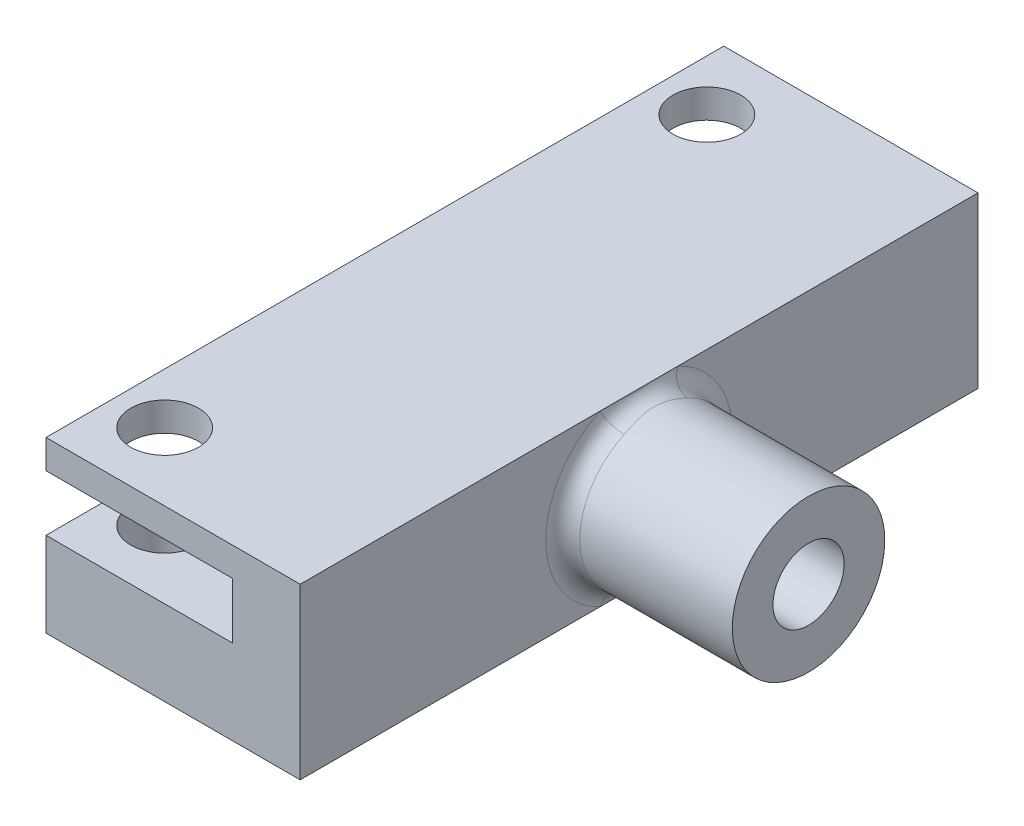
ISO-10303-21;
HEADER;
FILE_DESCRIPTION(('STEP AP214'),'2;1');
FILE_NAME('part.step','',(''),(''),'','','');
FILE_SCHEMA(('AUTOMOTIVE_DESIGN { 1 0 10303 214 1 1 1 1 }'));
ENDSEC;
DATA;
#1=APPLICATION_CONTEXT('core data for automotive mechanical design processes');
#2=APPLICATION_PROTOCOL_DEFINITION('international standard','automotive_design',2000,#1);
#3=PRODUCT_CONTEXT('',#1,'mechanical');
#4=PRODUCT('Part','Part','',(#3));
#5=PRODUCT_RELATED_PRODUCT_CATEGORY('part','',(#4));
#6=PRODUCT_DEFINITION_FORMATION('','',#4);
#7=PRODUCT_DEFINITION_CONTEXT('part definition',#1,'design');
#8=PRODUCT_DEFINITION('design','',#6,#7);
#9=PRODUCT_DEFINITION_SHAPE('','',#8);
#10=(LENGTH_UNIT() NAMED_UNIT(*) SI_UNIT(.MILLI.,.METRE.));
#11=(NAMED_UNIT(*) PLANE_ANGLE_UNIT() SI_UNIT($,.RADIAN.));
#12=(NAMED_UNIT(*) SI_UNIT($,.STERADIAN.) SOLID_ANGLE_UNIT());
#13=UNCERTAINTY_MEASURE_WITH_UNIT(LENGTH_MEASURE(1.E-05),#10,'distance_accuracy_value','');
#14=(GEOMETRIC_REPRESENTATION_CONTEXT(3) GLOBAL_UNCERTAINTY_ASSIGNED_CONTEXT((#13)) GLOBAL_UNIT_ASSIGNED_CONTEXT((#10,
#11,#12)) REPRESENTATION_CONTEXT('',''));
#15=CARTESIAN_POINT('',(0.,0.,0.));
#16=DIRECTION('',(0.,0.,1.));
#17=DIRECTION('',(1.,0.,0.));
#18=AXIS2_PLACEMENT_3D('',#15,#16,#17);
#19=CARTESIAN_POINT('',(4.,5.,40.));
#20=DIRECTION('',(-1.,0.,0.));
#21=DIRECTION('',(0.,-1.,0.));
#22=AXIS2_PLACEMENT_3D('',#19,#20,#21);
#23=PLANE('',#22);
#24=DIRECTION('',(0.,0.,-1.));
#25=VECTOR('',#24,1.);
#26=CARTESIAN_POINT('',(4.,5.,40.));
#27=LINE('',#26,#25);
#28=CARTESIAN_POINT('',(4.,5.,17.7087121525221));
#29=VERTEX_POINT('',#28);
#30=CARTESIAN_POINT('',(4.,5.,0.));
#31=VERTEX_POINT('',#30);
#32=EDGE_CURVE('E307',#29,#31,#27,.T.);
#33=ORIENTED_EDGE('',*,*,#32,.F.);
#34=CARTESIAN_POINT('',(4.,0.,20.));
#35=DIRECTION('',(-1.,0.,0.));
#36=DIRECTION('',(0.,-1.,0.));
#37=AXIS2_PLACEMENT_3D('',#34,#35,#36);
#38=CIRCLE('',#37,5.5);
#39=CARTESIAN_POINT('',(4.,-5.,17.7087121525221));
#40=VERTEX_POINT('',#39);
#41=EDGE_CURVE('E11',#29,#40,#38,.T.);
#42=ORIENTED_EDGE('',*,*,#41,.T.);
#43=DIRECTION('',(0.,0.,-1.));
#44=VECTOR('',#43,1.);
#45=CARTESIAN_POINT('',(4.,-5.,40.));
#46=LINE('',#45,#44);
#47=CARTESIAN_POINT('',(4.,-5.,0.));
#48=VERTEX_POINT('',#47);
#49=EDGE_CURVE('E281',#40,#48,#46,.T.);
#50=ORIENTED_EDGE('',*,*,#49,.T.);
#51=DIRECTION('',(0.,1.,0.));
#52=VECTOR('',#51,1.);
#53=CARTESIAN_POINT('',(4.,5.,0.));
#54=LINE('',#53,#52);
#55=EDGE_CURVE('E309',#48,#31,#54,.T.);
#56=ORIENTED_EDGE('',*,*,#55,.T.);
#57=EDGE_LOOP('',(#33,#42,#50,#56));
#58=FACE_BOUND('',#57,.T.);
#59=ADVANCED_FACE('F41',(#58),#23,.F.);
#60=CARTESIAN_POINT('',(0.,3.3,40.));
#61=DIRECTION('',(0.,1.,0.));
#62=DIRECTION('',(0.,0.,1.));
#63=AXIS2_PLACEMENT_3D('',#60,#61,#62);
#64=PLANE('',#63);
#65=CARTESIAN_POINT('',(-8.,3.3,36.));
#66=DIRECTION('',(0.,1.,0.));
#67=DIRECTION('',(0.,0.,1.));
#68=AXIS2_PLACEMENT_3D('',#65,#66,#67);
#69=CIRCLE('',#68,2.);
#70=CARTESIAN_POINT('',(-8.,3.3,38.));
#71=VERTEX_POINT('',#70);
#72=EDGE_CURVE('E298',#71,#71,#69,.T.);
#73=ORIENTED_EDGE('',*,*,#72,.T.);
#74=EDGE_LOOP('',(#73));
#75=FACE_BOUND('',#74,.T.);
#76=CARTESIAN_POINT('',(-8.,3.3,4.));
#77=DIRECTION('',(0.,1.,0.));
#78=DIRECTION('',(0.,0.,1.));
#79=AXIS2_PLACEMENT_3D('',#76,#77,#78);
#80=CIRCLE('',#79,2.);
#81=CARTESIAN_POINT('',(-8.,3.3,6.));
#82=VERTEX_POINT('',#81);
#83=EDGE_CURVE('E434',#82,#82,#80,.T.);
#84=ORIENTED_EDGE('',*,*,#83,.T.);
#85=EDGE_LOOP('',(#84));
#86=FACE_BOUND('',#85,.T.);
#87=DIRECTION('',(1.,0.,0.));
#88=VECTOR('',#87,1.);
#89=CARTESIAN_POINT('',(0.,3.3,0.));
#90=LINE('',#89,#88);
#91=CARTESIAN_POINT('',(-11.,3.3,0.));
#92=VERTEX_POINT('',#91);
#93=CARTESIAN_POINT('',(0.,3.3,0.));
#94=VERTEX_POINT('',#93);
#95=EDGE_CURVE('E163',#92,#94,#90,.T.);
#96=ORIENTED_EDGE('',*,*,#95,.T.);
#97=DIRECTION('',(0.,0.,-1.));
#98=VECTOR('',#97,1.);
#99=CARTESIAN_POINT('',(0.,3.3,40.));
#100=LINE('',#99,#98);
#101=CARTESIAN_POINT('',(0.,3.3,40.));
#102=VERTEX_POINT('',#101);
#103=EDGE_CURVE('E141',#102,#94,#100,.T.);
#104=ORIENTED_EDGE('',*,*,#103,.F.);
#105=DIRECTION('',(1.,0.,0.));
#106=VECTOR('',#105,1.);
#107=CARTESIAN_POINT('',(0.,3.3,40.));
#108=LINE('',#107,#106);
#109=CARTESIAN_POINT('',(-11.,3.3,40.));
#110=VERTEX_POINT('',#109);
#111=EDGE_CURVE('E149',#110,#102,#108,.T.);
#112=ORIENTED_EDGE('',*,*,#111,.F.);
#113=DIRECTION('',(0.,0.,-1.));
#114=VECTOR('',#113,1.);
#115=CARTESIAN_POINT('',(-11.,3.3,40.));
#116=LINE('',#115,#114);
#117=EDGE_CURVE('E356',#110,#92,#116,.T.);
#118=ORIENTED_EDGE('',*,*,#117,.T.);
#119=EDGE_LOOP('',(#96,#104,#112,#118));
#120=FACE_BOUND('',#119,.T.);
#121=ADVANCED_FACE('F161',(#75,#86,#120),#64,.F.);
#122=CARTESIAN_POINT('',(0.,0.,40.));
#123=DIRECTION('',(1.,0.,0.));
#124=DIRECTION('',(0.,0.,-1.));
#125=AXIS2_PLACEMENT_3D('',#122,#123,#124);
#126=PLANE('',#125);
#127=DIRECTION('',(0.,-1.,0.));
#128=VECTOR('',#127,1.);
#129=CARTESIAN_POINT('',(0.,0.,0.));
#130=LINE('',#129,#128);
#131=CARTESIAN_POINT('',(0.,0.,0.));
#132=VERTEX_POINT('',#131);
#133=EDGE_CURVE('E346',#94,#132,#130,.T.);
#134=ORIENTED_EDGE('',*,*,#133,.T.);
#135=DIRECTION('',(0.,0.,-1.));
#136=VECTOR('',#135,1.);
#137=CARTESIAN_POINT('',(0.,0.,40.));
#138=LINE('',#137,#136);
#139=CARTESIAN_POINT('',(0.,0.,40.));
#140=VERTEX_POINT('',#139);
#141=EDGE_CURVE('E144',#140,#132,#138,.T.);
#142=ORIENTED_EDGE('',*,*,#141,.F.);
#143=DIRECTION('',(0.,-1.,0.));
#144=VECTOR('',#143,1.);
#145=CARTESIAN_POINT('',(0.,0.,40.));
#146=LINE('',#145,#144);
#147=EDGE_CURVE('E137',#102,#140,#146,.T.);
#148=ORIENTED_EDGE('',*,*,#147,.F.);
#149=ORIENTED_EDGE('',*,*,#103,.T.);
#150=EDGE_LOOP('',(#134,#142,#148,#149));
#151=FACE_BOUND('',#150,.T.);
#152=ADVANCED_FACE('F139',(#151),#126,.F.);
#153=CARTESIAN_POINT('',(-11.,0.,40.));
#154=DIRECTION('',(0.,-1.,0.));
#155=DIRECTION('',(0.,0.,-1.));
#156=AXIS2_PLACEMENT_3D('',#153,#154,#155);
#157=PLANE('',#156);
#158=CARTESIAN_POINT('',(-8.,0.,36.));
#159=DIRECTION('',(0.,-1.,0.));
#160=DIRECTION('',(0.,0.,-1.));
#161=AXIS2_PLACEMENT_3D('',#158,#159,#160);
#162=CIRCLE('',#161,2.);
#163=CARTESIAN_POINT('',(-8.,0.,34.));
#164=VERTEX_POINT('',#163);
#165=EDGE_CURVE('E431',#164,#164,#162,.T.);
#166=ORIENTED_EDGE('',*,*,#165,.T.);
#167=EDGE_LOOP('',(#166));
#168=FACE_BOUND('',#167,.T.);
#169=CARTESIAN_POINT('',(-8.,0.,4.));
#170=DIRECTION('',(0.,-1.,0.));
#171=DIRECTION('',(0.,0.,-1.));
#172=AXIS2_PLACEMENT_3D('',#169,#170,#171);
#173=CIRCLE('',#172,2.);
#174=CARTESIAN_POINT('',(-8.,0.,2.));
#175=VERTEX_POINT('',#174);
#176=EDGE_CURVE('E441',#175,#175,#173,.T.);
#177=ORIENTED_EDGE('',*,*,#176,.T.);
#178=EDGE_LOOP('',(#177));
#179=FACE_BOUND('',#178,.T.);
#180=DIRECTION('',(-1.,0.,0.));
#181=VECTOR('',#180,1.);
#182=CARTESIAN_POINT('',(-11.,0.,0.));
#183=LINE('',#182,#181);
#184=CARTESIAN_POINT('',(-11.,0.,0.));
#185=VERTEX_POINT('',#184);
#186=EDGE_CURVE('E338',#132,#185,#183,.T.);
#187=ORIENTED_EDGE('',*,*,#186,.T.);
#188=DIRECTION('',(0.,0.,-1.));
#189=VECTOR('',#188,1.);
#190=CARTESIAN_POINT('',(-11.,0.,40.));
#191=LINE('',#190,#189);
#192=CARTESIAN_POINT('',(-11.,0.,40.));
#193=VERTEX_POINT('',#192);
#194=EDGE_CURVE('E171',#193,#185,#191,.T.);
#195=ORIENTED_EDGE('',*,*,#194,.F.);
#196=DIRECTION('',(-1.,0.,0.));
#197=VECTOR('',#196,1.);
#198=CARTESIAN_POINT('',(-11.,0.,40.));
#199=LINE('',#198,#197);
#200=EDGE_CURVE('E148',#140,#193,#199,.T.);
#201=ORIENTED_EDGE('',*,*,#200,.F.);
#202=ORIENTED_EDGE('',*,*,#141,.T.);
#203=EDGE_LOOP('',(#187,#195,#201,#202));
#204=FACE_BOUND('',#203,.T.);
#205=ADVANCED_FACE('F370',(#168,#179,#204),#157,.F.);
#206=CARTESIAN_POINT('',(-11.,-5.,40.));
#207=DIRECTION('',(1.,0.,0.));
#208=DIRECTION('',(0.,0.,-1.));
#209=AXIS2_PLACEMENT_3D('',#206,#207,#208);
#210=PLANE('',#209);
#211=DIRECTION('',(0.,-1.,0.));
#212=VECTOR('',#211,1.);
#213=CARTESIAN_POINT('',(-11.,-5.,0.));
#214=LINE('',#213,#212);
#215=CARTESIAN_POINT('',(-11.,-5.,0.));
#216=VERTEX_POINT('',#215);
#217=EDGE_CURVE('E331',#185,#216,#214,.T.);
#218=ORIENTED_EDGE('',*,*,#217,.T.);
#219=DIRECTION('',(0.,0.,-1.));
#220=VECTOR('',#219,1.);
#221=CARTESIAN_POINT('',(-11.,-5.,40.));
#222=LINE('',#221,#220);
#223=CARTESIAN_POINT('',(-11.,-5.,40.));
#224=VERTEX_POINT('',#223);
#225=EDGE_CURVE('E279',#224,#216,#222,.T.);
#226=ORIENTED_EDGE('',*,*,#225,.F.);
#227=DIRECTION('',(0.,-1.,0.));
#228=VECTOR('',#227,1.);
#229=CARTESIAN_POINT('',(-11.,-5.,40.));
#230=LINE('',#229,#228);
#231=EDGE_CURVE('E332',#193,#224,#230,.T.);
#232=ORIENTED_EDGE('',*,*,#231,.F.);
#233=ORIENTED_EDGE('',*,*,#194,.T.);
#234=EDGE_LOOP('',(#218,#226,#232,#233));
#235=FACE_BOUND('',#234,.T.);
#236=ADVANCED_FACE('F268',(#235),#210,.F.);
#237=CARTESIAN_POINT('',(4.,-5.,40.));
#238=DIRECTION('',(0.,1.,0.));
#239=DIRECTION('',(-1.,0.,0.));
#240=AXIS2_PLACEMENT_3D('',#237,#238,#239);
#241=PLANE('',#240);
#242=CARTESIAN_POINT('',(-8.,-5.,36.));
#243=DIRECTION('',(0.,1.,0.));
#244=DIRECTION('',(0.,0.,1.));
#245=AXIS2_PLACEMENT_3D('',#242,#243,#244);
#246=CIRCLE('',#245,2.);
#247=CARTESIAN_POINT('',(-8.,-5.,38.));
#248=VERTEX_POINT('',#247);
#249=EDGE_CURVE('E428',#248,#248,#246,.T.);
#250=ORIENTED_EDGE('',*,*,#249,.T.);
#251=EDGE_LOOP('',(#250));
#252=FACE_BOUND('',#251,.T.);
#253=CARTESIAN_POINT('',(-8.,-5.,4.));
#254=DIRECTION('',(0.,1.,0.));
#255=DIRECTION('',(0.,0.,1.));
#256=AXIS2_PLACEMENT_3D('',#253,#254,#255);
#257=CIRCLE('',#256,2.);
#258=CARTESIAN_POINT('',(-8.,-5.,6.));
#259=VERTEX_POINT('',#258);
#260=EDGE_CURVE('E465',#259,#259,#257,.T.);
#261=ORIENTED_EDGE('',*,*,#260,.T.);
#262=EDGE_LOOP('',(#261));
#263=FACE_BOUND('',#262,.T.);
#264=DIRECTION('',(1.,0.,0.));
#265=VECTOR('',#264,1.);
#266=CARTESIAN_POINT('',(4.,-5.,0.));
#267=LINE('',#266,#265);
#268=EDGE_CURVE('E340',#216,#48,#267,.T.);
#269=ORIENTED_EDGE('',*,*,#268,.T.);
#270=ORIENTED_EDGE('',*,*,#49,.F.);
#271=CARTESIAN_POINT('',(4.,-5.,22.2912878474779));
#272=VERTEX_POINT('',#271);
#273=EDGE_CURVE('E68',#272,#40,#46,.T.);
#274=ORIENTED_EDGE('',*,*,#273,.F.);
#275=CARTESIAN_POINT('',(4.,-5.,40.));
#276=VERTEX_POINT('',#275);
#277=EDGE_CURVE('E271',#276,#272,#46,.T.);
#278=ORIENTED_EDGE('',*,*,#277,.F.);
#279=DIRECTION('',(1.,0.,0.));
#280=VECTOR('',#279,1.);
#281=CARTESIAN_POINT('',(4.,-5.,40.));
#282=LINE('',#281,#280);
#283=EDGE_CURVE('E374',#224,#276,#282,.T.);
#284=ORIENTED_EDGE('',*,*,#283,.F.);
#285=ORIENTED_EDGE('',*,*,#225,.T.);
#286=EDGE_LOOP('',(#269,#270,#274,#278,#284,#285));
#287=FACE_BOUND('',#286,.T.);
#288=ADVANCED_FACE('F212',(#252,#263,#287),#241,.F.);
#289=ORIENTED_EDGE('',*,*,#277,.T.);
#290=CARTESIAN_POINT('',(4.,0.,20.));
#291=DIRECTION('',(-1.,0.,0.));
#292=DIRECTION('',(0.,-1.,0.));
#293=AXIS2_PLACEMENT_3D('',#290,#291,#292);
#294=CIRCLE('',#293,5.5);
#295=CARTESIAN_POINT('',(4.,5.,22.2912878474779));
#296=VERTEX_POINT('',#295);
#297=EDGE_CURVE('E55',#272,#296,#294,.T.);
#298=ORIENTED_EDGE('',*,*,#297,.T.);
#299=CARTESIAN_POINT('',(4.,5.,40.));
#300=VERTEX_POINT('',#299);
#301=EDGE_CURVE('E315',#300,#296,#27,.T.);
#302=ORIENTED_EDGE('',*,*,#301,.F.);
#303=DIRECTION('',(0.,1.,0.));
#304=VECTOR('',#303,1.);
#305=CARTESIAN_POINT('',(4.,5.,40.));
#306=LINE('',#305,#304);
#307=EDGE_CURVE('E276',#276,#300,#306,.T.);
#308=ORIENTED_EDGE('',*,*,#307,.F.);
#309=EDGE_LOOP('',(#289,#298,#302,#308));
#310=FACE_BOUND('',#309,.T.);
#311=ADVANCED_FACE('F209',(#310),#23,.F.);
#312=CARTESIAN_POINT('',(-11.,5.,40.));
#313=DIRECTION('',(0.,-1.,0.));
#314=DIRECTION('',(0.,0.,-1.));
#315=AXIS2_PLACEMENT_3D('',#312,#313,#314);
#316=PLANE('',#315);
#317=CARTESIAN_POINT('',(-8.,5.,36.));
#318=DIRECTION('',(0.,1.,0.));
#319=DIRECTION('',(0.,0.,1.));
#320=AXIS2_PLACEMENT_3D('',#317,#318,#319);
#321=CIRCLE('',#320,2.);
#322=CARTESIAN_POINT('',(-8.,5.,38.));
#323=VERTEX_POINT('',#322);
#324=EDGE_CURVE('E469',#323,#323,#321,.T.);
#325=ORIENTED_EDGE('',*,*,#324,.F.);
#326=EDGE_LOOP('',(#325));
#327=FACE_BOUND('',#326,.T.);
#328=CARTESIAN_POINT('',(-8.,5.,4.));
#329=DIRECTION('',(0.,1.,0.));
#330=DIRECTION('',(0.,0.,1.));
#331=AXIS2_PLACEMENT_3D('',#328,#329,#330);
#332=CIRCLE('',#331,2.);
#333=CARTESIAN_POINT('',(-8.,5.,6.));
#334=VERTEX_POINT('',#333);
#335=EDGE_CURVE('E461',#334,#334,#332,.T.);
#336=ORIENTED_EDGE('',*,*,#335,.F.);
#337=EDGE_LOOP('',(#336));
#338=FACE_BOUND('',#337,.T.);
#339=DIRECTION('',(-1.,0.,0.));
#340=VECTOR('',#339,1.);
#341=CARTESIAN_POINT('',(-11.,5.,0.));
#342=LINE('',#341,#340);
#343=CARTESIAN_POINT('',(-11.,5.,0.));
#344=VERTEX_POINT('',#343);
#345=EDGE_CURVE('E352',#31,#344,#342,.T.);
#346=ORIENTED_EDGE('',*,*,#345,.T.);
#347=DIRECTION('',(0.,0.,-1.));
#348=VECTOR('',#347,1.);
#349=CARTESIAN_POINT('',(-11.,5.,40.));
#350=LINE('',#349,#348);
#351=CARTESIAN_POINT('',(-11.,5.,40.));
#352=VERTEX_POINT('',#351);
#353=EDGE_CURVE('E313',#352,#344,#350,.T.);
#354=ORIENTED_EDGE('',*,*,#353,.F.);
#355=DIRECTION('',(-1.,0.,0.));
#356=VECTOR('',#355,1.);
#357=CARTESIAN_POINT('',(-11.,5.,40.));
#358=LINE('',#357,#356);
#359=EDGE_CURVE('E361',#300,#352,#358,.T.);
#360=ORIENTED_EDGE('',*,*,#359,.F.);
#361=ORIENTED_EDGE('',*,*,#301,.T.);
#362=EDGE_CURVE('E304',#296,#29,#27,.T.);
#363=ORIENTED_EDGE('',*,*,#362,.T.);
#364=ORIENTED_EDGE('',*,*,#32,.T.);
#365=EDGE_LOOP('',(#346,#354,#360,#361,#363,#364));
#366=FACE_BOUND('',#365,.T.);
#367=ADVANCED_FACE('F260',(#327,#338,#366),#316,.F.);
#368=CARTESIAN_POINT('',(-11.,3.3,40.));
#369=DIRECTION('',(1.,0.,0.));
#370=DIRECTION('',(0.,0.,-1.));
#371=AXIS2_PLACEMENT_3D('',#368,#369,#370);
#372=PLANE('',#371);
#373=DIRECTION('',(0.,-1.,0.));
#374=VECTOR('',#373,1.);
#375=CARTESIAN_POINT('',(-11.,3.3,0.));
#376=LINE('',#375,#374);
#377=EDGE_CURVE('E159',#344,#92,#376,.T.);
#378=ORIENTED_EDGE('',*,*,#377,.T.);
#379=ORIENTED_EDGE('',*,*,#117,.F.);
#380=DIRECTION('',(0.,-1.,0.));
#381=VECTOR('',#380,1.);
#382=CARTESIAN_POINT('',(-11.,3.3,40.));
#383=LINE('',#382,#381);
#384=EDGE_CURVE('E154',#352,#110,#383,.T.);
#385=ORIENTED_EDGE('',*,*,#384,.F.);
#386=ORIENTED_EDGE('',*,*,#353,.T.);
#387=EDGE_LOOP('',(#378,#379,#385,#386));
#388=FACE_BOUND('',#387,.T.);
#389=ADVANCED_FACE('F266',(#388),#372,.F.);
#390=CARTESIAN_POINT('',(0.,0.,40.));
#391=DIRECTION('',(0.,0.,-1.));
#392=DIRECTION('',(-1.,0.,0.));
#393=AXIS2_PLACEMENT_3D('',#390,#391,#392);
#394=PLANE('',#393);
#395=ORIENTED_EDGE('',*,*,#111,.T.);
#396=ORIENTED_EDGE('',*,*,#147,.T.);
#397=ORIENTED_EDGE('',*,*,#200,.T.);
#398=ORIENTED_EDGE('',*,*,#231,.T.);
#399=ORIENTED_EDGE('',*,*,#283,.T.);
#400=ORIENTED_EDGE('',*,*,#307,.T.);
#401=ORIENTED_EDGE('',*,*,#359,.T.);
#402=ORIENTED_EDGE('',*,*,#384,.T.);
#403=EDGE_LOOP('',(#395,#396,#397,#398,#399,#400,#401,#402));
#404=FACE_BOUND('',#403,.T.);
#405=ADVANCED_FACE('F152',(#404),#394,.F.);
#406=CARTESIAN_POINT('',(0.,0.,0.));
#407=DIRECTION('',(0.,0.,-1.));
#408=DIRECTION('',(-1.,0.,0.));
#409=AXIS2_PLACEMENT_3D('',#406,#407,#408);
#410=PLANE('',#409);
#411=ORIENTED_EDGE('',*,*,#95,.F.);
#412=ORIENTED_EDGE('',*,*,#377,.F.);
#413=ORIENTED_EDGE('',*,*,#345,.F.);
#414=ORIENTED_EDGE('',*,*,#55,.F.);
#415=ORIENTED_EDGE('',*,*,#268,.F.);
#416=ORIENTED_EDGE('',*,*,#217,.F.);
#417=ORIENTED_EDGE('',*,*,#186,.F.);
#418=ORIENTED_EDGE('',*,*,#133,.F.);
#419=EDGE_LOOP('',(#411,#412,#413,#414,#415,#416,#417,#418));
#420=FACE_BOUND('',#419,.T.);
#421=ADVANCED_FACE('F337',(#420),#410,.T.);
#422=CARTESIAN_POINT('',(14.,0.,20.));
#423=DIRECTION('',(1.,0.,0.));
#424=DIRECTION('',(0.,1.,0.));
#425=AXIS2_PLACEMENT_3D('',#422,#423,#424);
#426=PLANE('',#425);
#427=CARTESIAN_POINT('',(14.,0.,20.));
#428=DIRECTION('',(1.,0.,0.));
#429=DIRECTION('',(0.,1.,0.));
#430=AXIS2_PLACEMENT_3D('',#427,#428,#429);
#431=CIRCLE('',#430,4.5);
#432=CARTESIAN_POINT('',(14.,4.5,20.));
#433=VERTEX_POINT('',#432);
#434=EDGE_CURVE('E368',#433,#433,#431,.T.);
#435=ORIENTED_EDGE('',*,*,#434,.T.);
#436=EDGE_LOOP('',(#435));
#437=FACE_BOUND('',#436,.T.);
#438=CARTESIAN_POINT('',(14.,0.,20.));
#439=DIRECTION('',(1.,0.,0.));
#440=DIRECTION('',(0.,1.,0.));
#441=AXIS2_PLACEMENT_3D('',#438,#439,#440);
#442=CIRCLE('',#441,2.1);
#443=CARTESIAN_POINT('',(14.,2.1,20.));
#444=VERTEX_POINT('',#443);
#445=EDGE_CURVE('E445',#444,#444,#442,.T.);
#446=ORIENTED_EDGE('',*,*,#445,.F.);
#447=EDGE_LOOP('',(#446));
#448=FACE_BOUND('',#447,.T.);
#449=ADVANCED_FACE('F392',(#437,#448),#426,.T.);
#450=CARTESIAN_POINT('',(14.,0.,20.));
#451=DIRECTION('',(-1.,0.,0.));
#452=DIRECTION('',(0.,-1.,0.));
#453=AXIS2_PLACEMENT_3D('',#450,#451,#452);
#454=CYLINDRICAL_SURFACE('',#453,4.5);
#455=CARTESIAN_POINT('',(5.,0.,20.));
#456=DIRECTION('',(-1.,0.,0.));
#457=DIRECTION('',(0.,-1.,0.));
#458=AXIS2_PLACEMENT_3D('',#455,#456,#457);
#459=CIRCLE('',#458,4.5);
#460=CARTESIAN_POINT('',(5.,-4.09090909090909,18.1253099429726));
#461=VERTEX_POINT('',#460);
#462=CARTESIAN_POINT('',(5.,4.09090909090909,18.1253099429726));
#463=VERTEX_POINT('',#462);
#464=EDGE_CURVE('E165',#461,#463,#459,.F.);
#465=ORIENTED_EDGE('',*,*,#464,.T.);
#466=CARTESIAN_POINT('',(4.89980268618255,3.73393876780257,17.4884862575926));
#467=CARTESIAN_POINT('',(3.48940132317829,3.94696045096598,17.8051916403727));
#468=CARTESIAN_POINT('',(4.,5.,16.9303720926132));
#469=CARTESIAN_POINT('',(4.91875517679815,3.7660163024793,17.5361518202028));
#470=CARTESIAN_POINT('',(3.54267675943292,3.9421366135648,17.806457821017));
#471=CARTESIAN_POINT('',(4.,5.,16.9886300023851));
#472=CARTESIAN_POINT('',(4.93432888211617,3.79752415859403,17.5849906414992));
#473=CARTESIAN_POINT('',(3.59466185138125,3.94380984297682,17.8158823635887));
#474=CARTESIAN_POINT('',(4.,5.,17.048321895073));
#475=CARTESIAN_POINT('',(4.95980674885914,3.85896643460317,17.6844542129241));
#476=CARTESIAN_POINT('',(3.69168052997434,3.95645627119008,17.8478816349394));
#477=CARTESIAN_POINT('',(4.,5.,17.1698884824051));
#478=CARTESIAN_POINT('',(4.96972465819049,3.88890450785788,17.7350743121084));
#479=CARTESIAN_POINT('',(3.73710484762568,3.96705590696896,17.8699429285316));
#480=CARTESIAN_POINT('',(4.,5.,17.2317574925616));
#481=CARTESIAN_POINT('',(4.98498959684164,3.94666476101884,17.8373016855898));
#482=CARTESIAN_POINT('',(3.81998814107779,3.99358718250039,17.9236546713916));
#483=CARTESIAN_POINT('',(4.,5.,17.3567020601805));
#484=CARTESIAN_POINT('',(4.99037807381264,3.97450395692022,17.8888954904891));
#485=CARTESIAN_POINT('',(3.85786389780673,4.00931053118533,17.9549356972279));
#486=CARTESIAN_POINT('',(4.,5.,17.419761155046));
#487=CARTESIAN_POINT('',(4.99760774902755,4.02822327119306,17.9932947866256));
#488=CARTESIAN_POINT('',(3.92672527792871,4.043635816781,18.0248026450247));
#489=CARTESIAN_POINT('',(4.,5.,17.54736029476));
#490=CARTESIAN_POINT('',(4.99944616154779,4.05410183577859,18.0461011965401));
#491=CARTESIAN_POINT('',(3.95800324290997,4.06219454556076,18.0632573539657));
#492=CARTESIAN_POINT('',(4.,5.,17.6119014624364));
#493=CARTESIAN_POINT('',(5.00073660820922,4.12583442170718,18.2000522957203));
#494=CARTESIAN_POINT('',(4.03837463547946,4.11676073922267,18.180963318938));
#495=CARTESIAN_POINT('',(4.,5.,17.8000639169943));
#496=CARTESIAN_POINT('',(4.99661844902085,4.16901373085712,18.3024697766345));
#497=CARTESIAN_POINT('',(4.08165834204945,4.1549755688104,18.2686045059631));
#498=CARTESIAN_POINT('',(4.,5.,17.9252408381086));
#499=CARTESIAN_POINT('',(4.98268477148127,4.24760803014444,18.5099797285338));
#500=CARTESIAN_POINT('',(4.1511064969848,4.22841215489659,18.4562196688614));
#501=CARTESIAN_POINT('',(4.,5.,18.1788641126508));
#502=CARTESIAN_POINT('',(4.97286595162368,4.28301850461551,18.615073715852));
#503=CARTESIAN_POINT('',(4.17821291351062,4.26404589394782,18.5564738266611));
#504=CARTESIAN_POINT('',(4.,5.,18.3073123193745));
#505=CARTESIAN_POINT('',(4.95095988247223,4.34610963053365,18.8279460580946));
#506=CARTESIAN_POINT('',(4.22064381620443,4.32911457682245,18.7653299811448));
#507=CARTESIAN_POINT('',(4.,5.,18.5674896265602));
#508=CARTESIAN_POINT('',(4.93886200880405,4.37375250347942,18.9357348474117));
#509=CARTESIAN_POINT('',(4.23643651412229,4.35896572776856,18.8745497085902));
#510=CARTESIAN_POINT('',(4.,5.,18.6992314801688));
#511=CARTESIAN_POINT('',(4.91553832410221,4.42099221999677,19.1531227589253));
#512=CARTESIAN_POINT('',(4.26018466902875,4.41048128492815,19.0980421546623));
#513=CARTESIAN_POINT('',(4.,5.,18.9649278164628));
#514=CARTESIAN_POINT('',(4.90431250029528,4.44058918143815,19.2627218545768));
#515=CARTESIAN_POINT('',(4.26839824762161,4.43251464082034,19.2130364624769));
#516=CARTESIAN_POINT('',(4.,5.,19.0988822667046));
#517=CARTESIAN_POINT('',(4.88465296854667,4.47285316773795,19.492038302015));
#518=CARTESIAN_POINT('',(4.28055590189765,4.46879730869868,19.4550216591649));
#519=CARTESIAN_POINT('',(4.,5.,19.3791579246855));
#520=CARTESIAN_POINT('',(4.87651097080095,4.48484806770604,19.6118692918401));
#521=CARTESIAN_POINT('',(4.28424818338475,4.48262092813386,19.5833728362504));
#522=CARTESIAN_POINT('',(4.,5.,19.5256180233603));
#523=CARTESIAN_POINT('',(4.86666051596601,4.49918608673101,19.8522852890041));
#524=CARTESIAN_POINT('',(4.28850375225861,4.49902712138755,19.8408324084337));
#525=CARTESIAN_POINT('',(4.,5.,19.8194597976715));
#526=CARTESIAN_POINT('',(4.86495127027998,4.50153038886656,19.9728702021032));
#527=CARTESIAN_POINT('',(4.28910559506454,4.50175299972177,19.9710396561921));
#528=CARTESIAN_POINT('',(4.,5.,19.9668413581261));
#529=CARTESIAN_POINT('',(4.86846585523819,4.49653029259802,20.2139559613599));
#530=CARTESIAN_POINT('',(4.28770184555199,4.49601446069059,20.2298893582379));
#531=CARTESIAN_POINT('',(4.,5.,20.261501730551));
#532=CARTESIAN_POINT('',(4.87370070550519,4.4891704948179,20.3344563695587));
#533=CARTESIAN_POINT('',(4.28568017410062,4.48748227569834,20.3596475109347));
#534=CARTESIAN_POINT('',(4.,5.,20.4087800072385));
#535=CARTESIAN_POINT('',(4.88960928884929,4.46483876719611,20.5742339726209));
#536=CARTESIAN_POINT('',(4.27763329541693,4.45982856316421,20.6149534600325));
#537=CARTESIAN_POINT('',(4.,5.,20.7018415220922));
#538=CARTESIAN_POINT('',(4.90028382420807,4.4478654194417,20.6935109844015));
#539=CARTESIAN_POINT('',(4.27152785733029,4.44046691005838,20.7415728369778));
#540=CARTESIAN_POINT('',(4.,5.,20.8476245364907));
#541=CARTESIAN_POINT('',(4.92353797885236,4.40549838896973,20.9245068169184));
#542=CARTESIAN_POINT('',(4.25281818761711,4.39353993158291,20.9822041634925));
#543=CARTESIAN_POINT('',(4.,5.,21.1299527762336));
#544=CARTESIAN_POINT('',(4.93600266519425,4.38054419507448,21.0363150699124));
#545=CARTESIAN_POINT('',(4.24032749474115,4.36602869826739,21.097496513235));
#546=CARTESIAN_POINT('',(4.,5.,21.2666073076707));
#547=CARTESIAN_POINT('',(4.95996815013988,4.32215109281045,21.2578285015373));
#548=CARTESIAN_POINT('',(4.20541301348348,4.30417159929131,21.3197413775047));
#549=CARTESIAN_POINT('',(4.,5.,21.5373459463233));
#550=CARTESIAN_POINT('',(4.97146852083741,4.28870844399776,21.3675327300474));
#551=CARTESIAN_POINT('',(4.18255058215646,4.26936394381985,21.4273892900729));
#552=CARTESIAN_POINT('',(4.,5.,21.6714288922802));
#553=CARTESIAN_POINT('',(4.98976670182344,4.21372477524887,21.5835060872801));
#554=CARTESIAN_POINT('',(4.12263701137103,4.19613089725778,21.6299146000601));
#555=CARTESIAN_POINT('',(4.,5.,21.9353963288979));
#556=CARTESIAN_POINT('',(4.99659924215756,4.17224657881064,21.6897948508893));
#557=CARTESIAN_POINT('',(4.08485752913702,4.15724594934383,21.725348198695));
#558=CARTESIAN_POINT('',(4.,5.,22.0653048177536));
#559=CARTESIAN_POINT('',(5.00147899186292,4.08128912291143,21.8989582084996));
#560=CARTESIAN_POINT('',(3.9900024852855,4.08100674516155,21.8984992199887));
#561=CARTESIAN_POINT('',(4.,5.,22.3209489214995));
#562=CARTESIAN_POINT('',(4.99953987340491,4.031822430912,22.0018378642012));
#563=CARTESIAN_POINT('',(3.9314888105432,4.04335546255883,21.9761735168627));
#564=CARTESIAN_POINT('',(4.,5.,22.4466907229125));
#565=CARTESIAN_POINT('',(4.98508184107732,3.94637780936415,22.163533400405));
#566=CARTESIAN_POINT('',(3.81967477149457,3.99318329568096,22.0774114742975));
#567=CARTESIAN_POINT('',(4.,5.,22.644318600495));
#568=CARTESIAN_POINT('',(4.97700651231456,3.91271005015506,22.2238184221786));
#569=CARTESIAN_POINT('',(3.77180339339242,3.97635877375544,22.1106651563532));
#570=CARTESIAN_POINT('',(4.,5.,22.7180002937739));
#571=CARTESIAN_POINT('',(4.95395292141199,3.84287127031742,22.3424666149033));
#572=CARTESIAN_POINT('',(3.66697488223295,3.95158504892191,22.1631041188878));
#573=CARTESIAN_POINT('',(4.,5.,22.8630147515484));
#574=CARTESIAN_POINT('',(4.93893484329551,3.80668684765276,22.4008165916433));
#575=CARTESIAN_POINT('',(3.60937442059878,3.94407178079843,22.1816183266032));
#576=CARTESIAN_POINT('',(4.,5.,22.9343313897863));
#577=CARTESIAN_POINT('',(4.91963440408553,3.76954735003,22.4577454660485));
#578=CARTESIAN_POINT('',(3.54905242854793,3.94416290668541,22.1899302598129));
#579=CARTESIAN_POINT('',(4.,5.,23.0039111251704));
#580=(BOUNDED_SURFACE() B_SPLINE_SURFACE(3,2,((#466,#467,#468),(#469,#470,#471),(#472,#473,
#474),(#475,#476,#477),(#478,#479,#480),(#481,#482,#483),(#484,#485,#486),(#487,#488,#489),
(#490,#491,#492),(#493,#494,#495),(#496,#497,#498),(#499,#500,#501),(#502,#503,#504),(#505,#506,
#507),(#508,#509,#510),(#511,#512,#513),(#514,#515,#516),(#517,#518,#519),(#520,#521,#522),
(#523,#524,#525),(#526,#527,#528),(#529,#530,#531),(#532,#533,#534),(#535,#536,#537),(#538,#539,
#540),(#541,#542,#543),(#544,#545,#546),(#547,#548,#549),(#550,#551,#552),(#553,#554,#555),
(#556,#557,#558),(#559,#560,#561),(#562,#563,#564),(#565,#566,#567),(#568,#569,#570),(#571,#572,
#573),(#574,#575,#576),(#577,#578,#579)),.UNSPECIFIED.,.F.,.F.,
.F.) B_SPLINE_SURFACE_WITH_KNOTS((4,2,2,2,2,2,2,2,2,2,2,2,2,2,2,2,2,2,4),(3,3),(0.,
0.217953680057096,0.435375282757936,0.650784961949653,0.866363603817132,1.27343024900483,
1.68073288010726,2.08998347155476,2.49922806741089,2.94089907772549,3.38251594143456,
3.82483444833686,4.2672182102627,4.68853466067811,5.11003708778454,5.52836822147936,
5.94604753750293,6.20005411927748,6.45553582742003),(0.,1.),
.UNSPECIFIED.) GEOMETRIC_REPRESENTATION_ITEM() RATIONAL_B_SPLINE_SURFACE(((1.,0.564790372862957,
1.),(1.,0.577812289357245,1.),(1.,0.590526247920435,1.),(1.,0.615201731183071,1.),(1.,
0.627165016983745,1.),(1.,0.650160359470258,1.),(1.,0.661200008942789,1.),(1.,0.682438975822582,
1.),(1.,0.692637627299479,1.),(1.,0.720839981347169,1.),(1.,0.737729893143015,1.),(1.,
0.768384320647143,1.),(1.,0.782147018814949,1.),(1.,0.806620824007979,1.),(1.,0.817317021736378,
1.),(1.,0.83557366384836,1.),(1.,0.843134154168972,1.),(1.,0.855573378992894,1.),(1.,
0.860192159184212,1.),(1.,0.865712479863906,1.),(1.,0.866614475997428,1.),(1.,0.864689874113219,
1.),(1.,0.861857349808601,1.),(1.,0.852483998449057,1.),(1.,0.84594262437177,1.),(1.,
0.829588675978349,1.),(1.,0.819946718633055,1.),(1.,0.797334119684378,1.),(1.,0.784362010618375,
1.),(1.,0.755182925181128,1.),(1.,0.739001021570743,1.),(1.,0.703352825157187,1.),(1.,
0.683891689172233,1.),(1.,0.650048902309634,1.),(1.,0.636665167070145,1.),(1.,0.608756762665481,
1.),(1.,0.594225918985919,1.),(1.,0.579215398578112,1.))) REPRESENTATION_ITEM('') SURFACE());
#581=CARTESIAN_POINT('',(4.89980268618255,3.73393876780257,17.4884862575926));
#582=CARTESIAN_POINT('',(4.91875517679815,3.7660163024793,17.5361518202028));
#583=CARTESIAN_POINT('',(4.93432888211617,3.79752415859403,17.5849906414992));
#584=CARTESIAN_POINT('',(4.95980674885914,3.85896643460317,17.6844542129241));
#585=CARTESIAN_POINT('',(4.9697246581905,3.88890450785788,17.7350743121084));
#586=CARTESIAN_POINT('',(4.98498959684164,3.94666476101884,17.8373016855898));
#587=CARTESIAN_POINT('',(4.99037807381264,3.97450395692022,17.8888954904891));
#588=CARTESIAN_POINT('',(4.99760774902755,4.02822327119306,17.9932947866256));
#589=CARTESIAN_POINT('',(4.99944616154779,4.05410183577859,18.0461011965401));
#590=CARTESIAN_POINT('',(5.00073660820922,4.12583442170718,18.2000522957203));
#591=CARTESIAN_POINT('',(4.99661844902085,4.16901373085712,18.3024697766345));
#592=CARTESIAN_POINT('',(4.98268477148127,4.24760803014444,18.5099797285338));
#593=CARTESIAN_POINT('',(4.97286595162368,4.28301850461551,18.615073715852));
#594=CARTESIAN_POINT('',(4.95095988247223,4.34610963053365,18.8279460580946));
#595=CARTESIAN_POINT('',(4.93886200880405,4.37375250347942,18.9357348474117));
#596=CARTESIAN_POINT('',(4.91553832410221,4.42099221999677,19.1531227589253));
#597=CARTESIAN_POINT('',(4.90431250029528,4.44058918143815,19.2627218545768));
#598=CARTESIAN_POINT('',(4.88465296854667,4.47285316773795,19.492038302015));
#599=CARTESIAN_POINT('',(4.87651097080095,4.48484806770604,19.6118692918402));
#600=CARTESIAN_POINT('',(4.866660515966,4.49918608673101,19.8522852890041));
#601=CARTESIAN_POINT('',(4.86495127027998,4.50153038886656,19.9728702021032));
#602=CARTESIAN_POINT('',(4.86846585523819,4.49653029259802,20.2139559613599));
#603=CARTESIAN_POINT('',(4.87370070550519,4.4891704948179,20.3344563695587));
#604=CARTESIAN_POINT('',(4.88960928884929,4.46483876719611,20.5742339726209));
#605=CARTESIAN_POINT('',(4.90028382420807,4.4478654194417,20.6935109844015));
#606=CARTESIAN_POINT('',(4.92353797885236,4.40549838896973,20.9245068169184));
#607=CARTESIAN_POINT('',(4.93600266519425,4.38054419507448,21.0363150699124));
#608=CARTESIAN_POINT('',(4.95996815013988,4.32215109281045,21.2578285015373));
#609=CARTESIAN_POINT('',(4.97146852083741,4.28870844399776,21.3675327300474));
#610=CARTESIAN_POINT('',(4.98976670182344,4.21372477524887,21.5835060872801));
#611=CARTESIAN_POINT('',(4.99659924215756,4.17224657881064,21.6897948508893));
#612=CARTESIAN_POINT('',(5.00147899186292,4.08128912291143,21.8989582084996));
#613=CARTESIAN_POINT('',(4.99953987340491,4.031822430912,22.0018378642012));
#614=CARTESIAN_POINT('',(4.98508184107732,3.94637780936415,22.163533400405));
#615=CARTESIAN_POINT('',(4.97700651231456,3.91271005015506,22.2238184221786));
#616=CARTESIAN_POINT('',(4.95395292141199,3.84287127031742,22.3424666149033));
#617=CARTESIAN_POINT('',(4.93893484329551,3.80668684765276,22.4008165916433));
#618=CARTESIAN_POINT('',(4.91963440408553,3.76954735003,22.4577454660485));
#619=B_SPLINE_CURVE_WITH_KNOTS('',3,(#581,#582,#583,#584,#585,#586,#587,#588,#589,#590,#591,
#592,#593,#594,#595,#596,#597,#598,#599,#600,#601,#602,#603,#604,#605,#606,#607,#608,#609,#610,
#611,#612,#613,#614,#615,#616,#617,#618),.UNSPECIFIED.,.F.,.F.,(4,2,2,2,2,2,2,2,2,2,2,2,2,2,2,2,
2,2,4),(0.,0.217953680057096,0.435375282757936,0.650784961949653,0.866363603817132,
1.27343024900483,1.68073288010726,2.08998347155476,2.49922806741089,2.94089907772549,
3.38251594143456,3.82483444833686,4.2672182102627,4.68853466067811,5.11003708778454,
5.52836822147936,5.94604753750293,6.20005411927748,6.45553582742003),.UNSPECIFIED.);
#620=CARTESIAN_POINT('',(5.,4.09090909090909,21.8746900570274));
#621=VERTEX_POINT('',#620);
#622=EDGE_CURVE('E288',#463,#621,#619,.T.);
#623=ORIENTED_EDGE('',*,*,#622,.T.);
#624=CARTESIAN_POINT('',(5.,0.,20.));
#625=DIRECTION('',(-1.,0.,0.));
#626=DIRECTION('',(0.,-1.,0.));
#627=AXIS2_PLACEMENT_3D('',#624,#625,#626);
#628=CIRCLE('',#627,4.5);
#629=CARTESIAN_POINT('',(5.,-4.09090909090909,21.8746900570274));
#630=VERTEX_POINT('',#629);
#631=EDGE_CURVE('E183',#621,#630,#628,.F.);
#632=ORIENTED_EDGE('',*,*,#631,.T.);
#633=CARTESIAN_POINT('',(4.89980268618255,-3.73393876780256,22.5115137424074));
#634=CARTESIAN_POINT('',(3.48940132317829,-3.94696045096598,22.1948083596273));
#635=CARTESIAN_POINT('',(4.,-5.,23.0696279073868));
#636=CARTESIAN_POINT('',(4.91875517679815,-3.7660163024793,22.4638481797972));
#637=CARTESIAN_POINT('',(3.54267675943292,-3.9421366135648,22.193542178983));
#638=CARTESIAN_POINT('',(4.,-5.,23.0113699976149));
#639=CARTESIAN_POINT('',(4.93432888211617,-3.79752415859403,22.4150093585008));
#640=CARTESIAN_POINT('',(3.59466185138125,-3.94380984297682,22.1841176364113));
#641=CARTESIAN_POINT('',(4.,-5.,22.951678104927));
#642=CARTESIAN_POINT('',(4.95980674885915,-3.85896643460317,22.3155457870759));
#643=CARTESIAN_POINT('',(3.69168052997434,-3.95645627119008,22.1521183650606));
#644=CARTESIAN_POINT('',(4.,-5.,22.8301115175949));
#645=CARTESIAN_POINT('',(4.9697246581905,-3.88890450785788,22.2649256878916));
#646=CARTESIAN_POINT('',(3.73710484762568,-3.96705590696896,22.1300570714684));
#647=CARTESIAN_POINT('',(4.,-5.,22.7682425074384));
#648=CARTESIAN_POINT('',(4.98498959684164,-3.94666476101884,22.1626983144102));
#649=CARTESIAN_POINT('',(3.8199881410778,-3.99358718250039,22.0763453286084));
#650=CARTESIAN_POINT('',(4.,-5.,22.6432979398195));
#651=CARTESIAN_POINT('',(4.99037807381264,-3.97450395692022,22.1111045095109));
#652=CARTESIAN_POINT('',(3.85786389780673,-4.00931053118533,22.0450643027721));
#653=CARTESIAN_POINT('',(4.,-5.,22.580238844954));
#654=CARTESIAN_POINT('',(4.99760774902756,-4.02822327119306,22.0067052133744));
#655=CARTESIAN_POINT('',(3.92672527792871,-4.043635816781,21.9751973549753));
#656=CARTESIAN_POINT('',(4.,-5.,22.45263970524));
#657=CARTESIAN_POINT('',(4.99944616154779,-4.05410183577859,21.9538988034599));
#658=CARTESIAN_POINT('',(3.95800324290998,-4.06219454556076,21.9367426460343));
#659=CARTESIAN_POINT('',(4.,-5.,22.3880985375636));
#660=CARTESIAN_POINT('',(5.00073660820922,-4.12583442170718,21.7999477042797));
#661=CARTESIAN_POINT('',(4.03837463547947,-4.11676073922267,21.819036681062));
#662=CARTESIAN_POINT('',(4.,-5.,22.1999360830057));
#663=CARTESIAN_POINT('',(4.99661844902086,-4.16901373085712,21.6975302233655));
#664=CARTESIAN_POINT('',(4.08165834204946,-4.1549755688104,21.7313954940369));
#665=CARTESIAN_POINT('',(4.,-5.,22.0747591618914));
#666=CARTESIAN_POINT('',(4.98268477148127,-4.24760803014444,21.4900202714662));
#667=CARTESIAN_POINT('',(4.1511064969848,-4.22841215489659,21.5437803311386));
#668=CARTESIAN_POINT('',(4.,-5.,21.8211358873492));
#669=CARTESIAN_POINT('',(4.97286595162368,-4.28301850461551,21.384926284148));
#670=CARTESIAN_POINT('',(4.17821291351062,-4.26404589394782,21.4435261733389));
#671=CARTESIAN_POINT('',(4.,-5.,21.6926876806255));
#672=CARTESIAN_POINT('',(4.95095988247223,-4.34610963053365,21.1720539419054));
#673=CARTESIAN_POINT('',(4.22064381620443,-4.32911457682245,21.2346700188552));
#674=CARTESIAN_POINT('',(4.,-5.,21.4325103734398));
#675=CARTESIAN_POINT('',(4.93886200880405,-4.37375250347942,21.0642651525883));
#676=CARTESIAN_POINT('',(4.23643651412229,-4.35896572776856,21.1254502914098));
#677=CARTESIAN_POINT('',(4.,-5.,21.3007685198312));
#678=CARTESIAN_POINT('',(4.91553832410221,-4.42099221999677,20.8468772410747));
#679=CARTESIAN_POINT('',(4.26018466902875,-4.41048128492815,20.9019578453377));
#680=CARTESIAN_POINT('',(4.,-5.,21.0350721835372));
#681=CARTESIAN_POINT('',(4.90431250029527,-4.44058918143815,20.7372781454232));
#682=CARTESIAN_POINT('',(4.26839824762161,-4.43251464082034,20.7869635375231));
#683=CARTESIAN_POINT('',(4.,-5.,20.9011177332954));
#684=CARTESIAN_POINT('',(4.88465296854667,-4.47285316773795,20.507961697985));
#685=CARTESIAN_POINT('',(4.28055590189765,-4.46879730869868,20.5449783408351));
#686=CARTESIAN_POINT('',(4.,-5.,20.6208420753145));
#687=CARTESIAN_POINT('',(4.87651097080095,-4.48484806770604,20.3881307081599));
#688=CARTESIAN_POINT('',(4.28424818338475,-4.48262092813386,20.4166271637496));
#689=CARTESIAN_POINT('',(4.,-5.,20.4743819766397));
#690=CARTESIAN_POINT('',(4.866660515966,-4.49918608673101,20.1477147109959));
#691=CARTESIAN_POINT('',(4.28850375225862,-4.49902712138755,20.1591675915663));
#692=CARTESIAN_POINT('',(4.,-5.,20.1805402023285));
#693=CARTESIAN_POINT('',(4.86495127027998,-4.50153038886656,20.0271297978968));
#694=CARTESIAN_POINT('',(4.28910559506454,-4.50175299972177,20.0289603438079));
#695=CARTESIAN_POINT('',(4.,-5.,20.0331586418739));
#696=CARTESIAN_POINT('',(4.86846585523819,-4.49653029259802,19.7860440386401));
#697=CARTESIAN_POINT('',(4.28770184555199,-4.49601446069059,19.7701106417621));
#698=CARTESIAN_POINT('',(4.,-5.,19.738498269449));
#699=CARTESIAN_POINT('',(4.87370070550518,-4.4891704948179,19.6655436304413));
#700=CARTESIAN_POINT('',(4.28568017410062,-4.48748227569834,19.6403524890653));
#701=CARTESIAN_POINT('',(4.,-5.,19.5912199927615));
#702=CARTESIAN_POINT('',(4.88960928884929,-4.46483876719611,19.4257660273791));
#703=CARTESIAN_POINT('',(4.27763329541693,-4.45982856316421,19.3850465399675));
#704=CARTESIAN_POINT('',(4.,-5.,19.2981584779078));
#705=CARTESIAN_POINT('',(4.90028382420807,-4.4478654194417,19.3064890155985));
#706=CARTESIAN_POINT('',(4.27152785733029,-4.44046691005838,19.2584271630222));
#707=CARTESIAN_POINT('',(4.,-5.,19.1523754635093));
#708=CARTESIAN_POINT('',(4.92353797885236,-4.40549838896973,19.0754931830816));
#709=CARTESIAN_POINT('',(4.25281818761711,-4.39353993158291,19.0177958365075));
#710=CARTESIAN_POINT('',(4.,-5.,18.8700472237664));
#711=CARTESIAN_POINT('',(4.93600266519425,-4.38054419507448,18.9636849300876));
#712=CARTESIAN_POINT('',(4.24032749474115,-4.36602869826739,18.902503486765));
#713=CARTESIAN_POINT('',(4.,-5.,18.7333926923293));
#714=CARTESIAN_POINT('',(4.95996815013988,-4.32215109281045,18.7421714984627));
#715=CARTESIAN_POINT('',(4.20541301348349,-4.30417159929131,18.6802586224953));
#716=CARTESIAN_POINT('',(4.,-5.,18.4626540536767));
#717=CARTESIAN_POINT('',(4.97146852083741,-4.28870844399776,18.6324672699526));
#718=CARTESIAN_POINT('',(4.18255058215646,-4.26936394381985,18.5726107099271));
#719=CARTESIAN_POINT('',(4.,-5.,18.3285711077198));
#720=CARTESIAN_POINT('',(4.98976670182344,-4.21372477524887,18.4164939127199));
#721=CARTESIAN_POINT('',(4.12263701137103,-4.19613089725778,18.3700853999399));
#722=CARTESIAN_POINT('',(4.,-5.,18.0646036711021));
#723=CARTESIAN_POINT('',(4.99659924215756,-4.17224657881064,18.3102051491107));
#724=CARTESIAN_POINT('',(4.08485752913702,-4.15724594934383,18.274651801305));
#725=CARTESIAN_POINT('',(4.,-5.,17.9346951822464));
#726=CARTESIAN_POINT('',(5.00147899186292,-4.08128912291143,18.1010417915004));
#727=CARTESIAN_POINT('',(3.9900024852855,-4.08100674516155,18.1015007800113));
#728=CARTESIAN_POINT('',(4.,-5.,17.6790510785005));
#729=CARTESIAN_POINT('',(4.99953987340491,-4.031822430912,17.9981621357988));
#730=CARTESIAN_POINT('',(3.9314888105432,-4.04335546255883,18.0238264831373));
#731=CARTESIAN_POINT('',(4.,-5.,17.5533092770875));
#732=CARTESIAN_POINT('',(4.98508184107732,-3.94637780936415,17.836466599595));
#733=CARTESIAN_POINT('',(3.81967477149458,-3.99318329568096,17.9225885257025));
#734=CARTESIAN_POINT('',(4.,-5.,17.355681399505));
#735=CARTESIAN_POINT('',(4.97700651231456,-3.91271005015506,17.7761815778214));
#736=CARTESIAN_POINT('',(3.77180339339243,-3.97635877375544,17.8893348436468));
#737=CARTESIAN_POINT('',(4.,-5.,17.2819997062261));
#738=CARTESIAN_POINT('',(4.953952921412,-3.84287127031742,17.6575333850967));
#739=CARTESIAN_POINT('',(3.66697488223296,-3.95158504892191,17.8368958811122));
#740=CARTESIAN_POINT('',(4.,-5.,17.1369852484516));
#741=CARTESIAN_POINT('',(4.93893484329551,-3.80668684765276,17.5991834083567));
#742=CARTESIAN_POINT('',(3.60937442059878,-3.94407178079843,17.8183816733968));
#743=CARTESIAN_POINT('',(4.,-5.,17.0656686102137));
#744=CARTESIAN_POINT('',(4.91963440408554,-3.76954735003,17.5422545339515));
#745=CARTESIAN_POINT('',(3.54905242854794,-3.94416290668541,17.8100697401871));
#746=CARTESIAN_POINT('',(4.,-5.,16.9960888748296));
#747=(BOUNDED_SURFACE() B_SPLINE_SURFACE(3,2,((#633,#634,#635),(#636,#637,#638),(#639,#640,
#641),(#642,#643,#644),(#645,#646,#647),(#648,#649,#650),(#651,#652,#653),(#654,#655,#656),
(#657,#658,#659),(#660,#661,#662),(#663,#664,#665),(#666,#667,#668),(#669,#670,#671),(#672,#673,
#674),(#675,#676,#677),(#678,#679,#680),(#681,#682,#683),(#684,#685,#686),(#687,#688,#689),
(#690,#691,#692),(#693,#694,#695),(#696,#697,#698),(#699,#700,#701),(#702,#703,#704),(#705,#706,
#707),(#708,#709,#710),(#711,#712,#713),(#714,#715,#716),(#717,#718,#719),(#720,#721,#722),
(#723,#724,#725),(#726,#727,#728),(#729,#730,#731),(#732,#733,#734),(#735,#736,#737),(#738,#739,
#740),(#741,#742,#743),(#744,#745,#746)),.UNSPECIFIED.,.F.,.F.,
.F.) B_SPLINE_SURFACE_WITH_KNOTS((4,2,2,2,2,2,2,2,2,2,2,2,2,2,2,2,2,2,4),(3,3),(0.,
0.217953680057098,0.435375282757936,0.650784961949665,0.866363603817132,1.27343024900483,
1.68073288010726,2.08998347155476,2.49922806741089,2.9408990777255,3.38251594143457,
3.82483444833687,4.2672182102627,4.68853466067812,5.11003708778454,5.52836822147936,
5.94604753750293,6.20005411927748,6.45553582742004),(0.,1.),
.UNSPECIFIED.) GEOMETRIC_REPRESENTATION_ITEM() RATIONAL_B_SPLINE_SURFACE(((1.,0.564790372862958,
1.),(1.,0.577812289357245,1.),(1.,0.590526247920435,1.),(1.,0.615201731183071,1.),(1.,
0.627165016983746,1.),(1.,0.650160359470259,1.),(1.,0.661200008942791,1.),(1.,0.682438975822584,
1.),(1.,0.69263762729948,1.),(1.,0.72083998134717,1.),(1.,0.737729893143016,1.),(1.,
0.768384320647144,1.),(1.,0.78214701881495,1.),(1.,0.80662082400798,1.),(1.,0.817317021736379,
1.),(1.,0.835573663848361,1.),(1.,0.843134154168973,1.),(1.,0.855573378992895,1.),(1.,
0.860192159184213,1.),(1.,0.865712479863907,1.),(1.,0.866614475997429,1.),(1.,0.86468987411322,
1.),(1.,0.861857349808602,1.),(1.,0.852483998449058,1.),(1.,0.845942624371771,1.),(1.,
0.82958867597835,1.),(1.,0.819946718633056,1.),(1.,0.797334119684379,1.),(1.,0.784362010618376,
1.),(1.,0.755182925181128,1.),(1.,0.739001021570744,1.),(1.,0.703352825157188,1.),(1.,
0.683891689172235,1.),(1.,0.650048902309636,1.),(1.,0.636665167070147,1.),(1.,0.608756762665482,
1.),(1.,0.594225918985921,1.),(1.,0.579215398578113,1.))) REPRESENTATION_ITEM('') SURFACE());
#748=CARTESIAN_POINT('',(4.89980268618255,-3.73393876780256,22.5115137424074));
#749=CARTESIAN_POINT('',(4.91875517679815,-3.7660163024793,22.4638481797972));
#750=CARTESIAN_POINT('',(4.93432888211617,-3.79752415859403,22.4150093585008));
#751=CARTESIAN_POINT('',(4.95980674885915,-3.85896643460317,22.3155457870759));
#752=CARTESIAN_POINT('',(4.9697246581905,-3.88890450785788,22.2649256878916));
#753=CARTESIAN_POINT('',(4.98498959684164,-3.94666476101884,22.1626983144102));
#754=CARTESIAN_POINT('',(4.99037807381264,-3.97450395692022,22.1111045095109));
#755=CARTESIAN_POINT('',(4.99760774902756,-4.02822327119306,22.0067052133744));
#756=CARTESIAN_POINT('',(4.99944616154779,-4.05410183577859,21.9538988034599));
#757=CARTESIAN_POINT('',(5.00073660820922,-4.12583442170718,21.7999477042797));
#758=CARTESIAN_POINT('',(4.99661844902086,-4.16901373085712,21.6975302233655));
#759=CARTESIAN_POINT('',(4.98268477148127,-4.24760803014444,21.4900202714662));
#760=CARTESIAN_POINT('',(4.97286595162368,-4.28301850461551,21.384926284148));
#761=CARTESIAN_POINT('',(4.95095988247223,-4.34610963053365,21.1720539419054));
#762=CARTESIAN_POINT('',(4.93886200880405,-4.37375250347942,21.0642651525883));
#763=CARTESIAN_POINT('',(4.91553832410221,-4.42099221999677,20.8468772410747));
#764=CARTESIAN_POINT('',(4.90431250029527,-4.44058918143815,20.7372781454232));
#765=CARTESIAN_POINT('',(4.88465296854667,-4.47285316773795,20.507961697985));
#766=CARTESIAN_POINT('',(4.87651097080095,-4.48484806770604,20.3881307081598));
#767=CARTESIAN_POINT('',(4.866660515966,-4.49918608673101,20.1477147109959));
#768=CARTESIAN_POINT('',(4.86495127027998,-4.50153038886656,20.0271297978968));
#769=CARTESIAN_POINT('',(4.86846585523819,-4.49653029259802,19.7860440386401));
#770=CARTESIAN_POINT('',(4.87370070550518,-4.4891704948179,19.6655436304413));
#771=CARTESIAN_POINT('',(4.88960928884929,-4.46483876719611,19.4257660273791));
#772=CARTESIAN_POINT('',(4.90028382420807,-4.4478654194417,19.3064890155985));
#773=CARTESIAN_POINT('',(4.92353797885236,-4.40549838896973,19.0754931830816));
#774=CARTESIAN_POINT('',(4.93600266519425,-4.38054419507448,18.9636849300876));
#775=CARTESIAN_POINT('',(4.95996815013988,-4.32215109281045,18.7421714984627));
#776=CARTESIAN_POINT('',(4.97146852083741,-4.28870844399776,18.6324672699526));
#777=CARTESIAN_POINT('',(4.98976670182344,-4.21372477524887,18.4164939127199));
#778=CARTESIAN_POINT('',(4.99659924215756,-4.17224657881064,18.3102051491107));
#779=CARTESIAN_POINT('',(5.00147899186292,-4.08128912291143,18.1010417915004));
#780=CARTESIAN_POINT('',(4.99953987340491,-4.031822430912,17.9981621357988));
#781=CARTESIAN_POINT('',(4.98508184107732,-3.94637780936415,17.836466599595));
#782=CARTESIAN_POINT('',(4.97700651231456,-3.91271005015506,17.7761815778214));
#783=CARTESIAN_POINT('',(4.953952921412,-3.84287127031742,17.6575333850967));
#784=CARTESIAN_POINT('',(4.93893484329551,-3.80668684765276,17.5991834083567));
#785=CARTESIAN_POINT('',(4.91963440408554,-3.76954735003,17.5422545339515));
#786=B_SPLINE_CURVE_WITH_KNOTS('',3,(#748,#749,#750,#751,#752,#753,#754,#755,#756,#757,#758,
#759,#760,#761,#762,#763,#764,#765,#766,#767,#768,#769,#770,#771,#772,#773,#774,#775,#776,#777,
#778,#779,#780,#781,#782,#783,#784,#785),.UNSPECIFIED.,.F.,.F.,(4,2,2,2,2,2,2,2,2,2,2,2,2,2,2,2,
2,2,4),(0.,0.217953680057098,0.435375282757936,0.650784961949665,0.866363603817132,
1.27343024900483,1.68073288010726,2.08998347155476,2.49922806741089,2.9408990777255,
3.38251594143457,3.82483444833687,4.2672182102627,4.68853466067812,5.11003708778454,
5.52836822147936,5.94604753750293,6.20005411927748,6.45553582742004),.UNSPECIFIED.);
#787=EDGE_CURVE('E169',#630,#461,#786,.T.);
#788=ORIENTED_EDGE('',*,*,#787,.T.);
#789=EDGE_LOOP('',(#465,#623,#632,#788));
#790=FACE_BOUND('',#789,.T.);
#791=ORIENTED_EDGE('',*,*,#434,.F.);
#792=EDGE_LOOP('',(#791));
#793=FACE_BOUND('',#792,.T.);
#794=ADVANCED_FACE('F185',(#790,#793),#454,.T.);
#795=CARTESIAN_POINT('',(14.,0.,20.));
#796=DIRECTION('',(-1.,0.,0.));
#797=DIRECTION('',(0.,-1.,0.));
#798=AXIS2_PLACEMENT_3D('',#795,#796,#797);
#799=CYLINDRICAL_SURFACE('',#798,2.1);
#800=ORIENTED_EDGE('',*,*,#445,.T.);
#801=EDGE_LOOP('',(#800));
#802=FACE_BOUND('',#801,.T.);
#803=CARTESIAN_POINT('',(4.,0.,20.));
#804=DIRECTION('',(1.,0.,0.));
#805=DIRECTION('',(0.,1.,0.));
#806=AXIS2_PLACEMENT_3D('',#803,#804,#805);
#807=CIRCLE('',#806,2.1);
#808=CARTESIAN_POINT('',(4.,2.1,20.));
#809=VERTEX_POINT('',#808);
#810=EDGE_CURVE('E221',#809,#809,#807,.T.);
#811=ORIENTED_EDGE('',*,*,#810,.F.);
#812=EDGE_LOOP('',(#811));
#813=FACE_BOUND('',#812,.T.);
#814=ADVANCED_FACE('F257',(#802,#813),#799,.F.);
#815=ORIENTED_EDGE('',*,*,#810,.T.);
#816=EDGE_LOOP('',(#815));
#817=FACE_BOUND('',#816,.T.);
#818=ADVANCED_FACE('F202',(#817),#23,.F.);
#819=CARTESIAN_POINT('',(5.,-5.,22.2912878474779));
#820=DIRECTION('',(0.,0.416597790450532,0.909090909090909));
#821=DIRECTION('',(0.,-0.909090909090909,0.416597790450532));
#822=AXIS2_PLACEMENT_3D('',#819,#820,#821);
#823=CIRCLE('',#822,1.);
#824=EDGE_CURVE('E222',#272,#630,#823,.F.);
#825=ORIENTED_EDGE('',*,*,#824,.F.);
#826=ORIENTED_EDGE('',*,*,#273,.T.);
#827=CARTESIAN_POINT('',(5.,-5.,17.7087121525221));
#828=DIRECTION('',(0.,-0.416597790450532,0.909090909090909));
#829=DIRECTION('',(0.,-0.909090909090909,-0.416597790450532));
#830=AXIS2_PLACEMENT_3D('',#827,#828,#829);
#831=CIRCLE('',#830,1.);
#832=EDGE_CURVE('E217',#461,#40,#831,.T.);
#833=ORIENTED_EDGE('',*,*,#832,.F.);
#834=ORIENTED_EDGE('',*,*,#787,.F.);
#835=EDGE_LOOP('',(#825,#826,#833,#834));
#836=FACE_BOUND('',#835,.T.);
#837=ADVANCED_FACE('F196',(#836),#747,.F.);
#838=CARTESIAN_POINT('',(5.,0.,20.));
#839=DIRECTION('',(-1.,0.,0.));
#840=DIRECTION('',(0.,-1.,0.));
#841=AXIS2_PLACEMENT_3D('',#838,#839,#840);
#842=TOROIDAL_SURFACE('',#841,5.5,1.);
#843=ORIENTED_EDGE('',*,*,#832,.T.);
#844=ORIENTED_EDGE('',*,*,#41,.F.);
#845=CARTESIAN_POINT('',(5.,5.,17.7087121525221));
#846=DIRECTION('',(0.,-0.41659779045053,-0.90909090909091));
#847=DIRECTION('',(0.,0.90909090909091,-0.41659779045053));
#848=AXIS2_PLACEMENT_3D('',#845,#846,#847);
#849=CIRCLE('',#848,1.);
#850=EDGE_CURVE('E226',#463,#29,#849,.T.);
#851=ORIENTED_EDGE('',*,*,#850,.F.);
#852=ORIENTED_EDGE('',*,*,#464,.F.);
#853=EDGE_LOOP('',(#843,#844,#851,#852));
#854=FACE_BOUND('',#853,.T.);
#855=ADVANCED_FACE('F201',(#854),#842,.F.);
#856=CARTESIAN_POINT('',(5.,0.,20.));
#857=DIRECTION('',(-1.,0.,0.));
#858=DIRECTION('',(0.,-1.,0.));
#859=AXIS2_PLACEMENT_3D('',#856,#857,#858);
#860=TOROIDAL_SURFACE('',#859,5.5,1.);
#861=ORIENTED_EDGE('',*,*,#824,.T.);
#862=ORIENTED_EDGE('',*,*,#631,.F.);
#863=CARTESIAN_POINT('',(5.,5.,22.2912878474779));
#864=DIRECTION('',(0.,-0.416597790450533,0.909090909090908));
#865=DIRECTION('',(0.,-0.909090909090908,-0.416597790450533));
#866=AXIS2_PLACEMENT_3D('',#863,#864,#865);
#867=CIRCLE('',#866,1.);
#868=EDGE_CURVE('E286',#296,#621,#867,.T.);
#869=ORIENTED_EDGE('',*,*,#868,.F.);
#870=ORIENTED_EDGE('',*,*,#297,.F.);
#871=EDGE_LOOP('',(#861,#862,#869,#870));
#872=FACE_BOUND('',#871,.T.);
#873=ADVANCED_FACE('F240',(#872),#860,.F.);
#874=ORIENTED_EDGE('',*,*,#850,.T.);
#875=ORIENTED_EDGE('',*,*,#362,.F.);
#876=ORIENTED_EDGE('',*,*,#868,.T.);
#877=ORIENTED_EDGE('',*,*,#622,.F.);
#878=EDGE_LOOP('',(#874,#875,#876,#877));
#879=FACE_BOUND('',#878,.T.);
#880=ADVANCED_FACE('F242',(#879),#580,.F.);
#881=CARTESIAN_POINT('',(-8.,-5.,4.));
#882=DIRECTION('',(0.,1.,0.));
#883=DIRECTION('',(0.,0.,1.));
#884=AXIS2_PLACEMENT_3D('',#881,#882,#883);
#885=CYLINDRICAL_SURFACE('',#884,2.);
#886=ORIENTED_EDGE('',*,*,#335,.T.);
#887=EDGE_LOOP('',(#886));
#888=FACE_BOUND('',#887,.T.);
#889=ORIENTED_EDGE('',*,*,#83,.F.);
#890=EDGE_LOOP('',(#889));
#891=FACE_BOUND('',#890,.T.);
#892=ADVANCED_FACE('F248',(#888,#891),#885,.F.);
#893=CARTESIAN_POINT('',(-8.,-5.,36.));
#894=DIRECTION('',(0.,1.,0.));
#895=DIRECTION('',(0.,0.,1.));
#896=AXIS2_PLACEMENT_3D('',#893,#894,#895);
#897=CYLINDRICAL_SURFACE('',#896,2.);
#898=ORIENTED_EDGE('',*,*,#324,.T.);
#899=EDGE_LOOP('',(#898));
#900=FACE_BOUND('',#899,.T.);
#901=ORIENTED_EDGE('',*,*,#72,.F.);
#902=EDGE_LOOP('',(#901));
#903=FACE_BOUND('',#902,.T.);
#904=ADVANCED_FACE('F409',(#900,#903),#897,.F.);
#905=ORIENTED_EDGE('',*,*,#260,.F.);
#906=EDGE_LOOP('',(#905));
#907=FACE_BOUND('',#906,.T.);
#908=ORIENTED_EDGE('',*,*,#176,.F.);
#909=EDGE_LOOP('',(#908));
#910=FACE_BOUND('',#909,.T.);
#911=ADVANCED_FACE('F411',(#907,#910),#885,.F.);
#912=ORIENTED_EDGE('',*,*,#249,.F.);
#913=EDGE_LOOP('',(#912));
#914=FACE_BOUND('',#913,.T.);
#915=ORIENTED_EDGE('',*,*,#165,.F.);
#916=EDGE_LOOP('',(#915));
#917=FACE_BOUND('',#916,.T.);
#918=ADVANCED_FACE('F414',(#914,#917),#897,.F.);
#919=CLOSED_SHELL('',(#59,#121,#152,#205,#236,#288,#311,#367,#389,#405,#421,#449,#794,#814,#818,
#837,#855,#873,#880,#892,#904,#911,#918));
#920=MANIFOLD_SOLID_BREP('B2',#919);
#921=ADVANCED_BREP_SHAPE_REPRESENTATION('',(#18,#920),#14);
#922=SHAPE_DEFINITION_REPRESENTATION(#9,#921);
ENDSEC;
END-ISO-10303-21;
